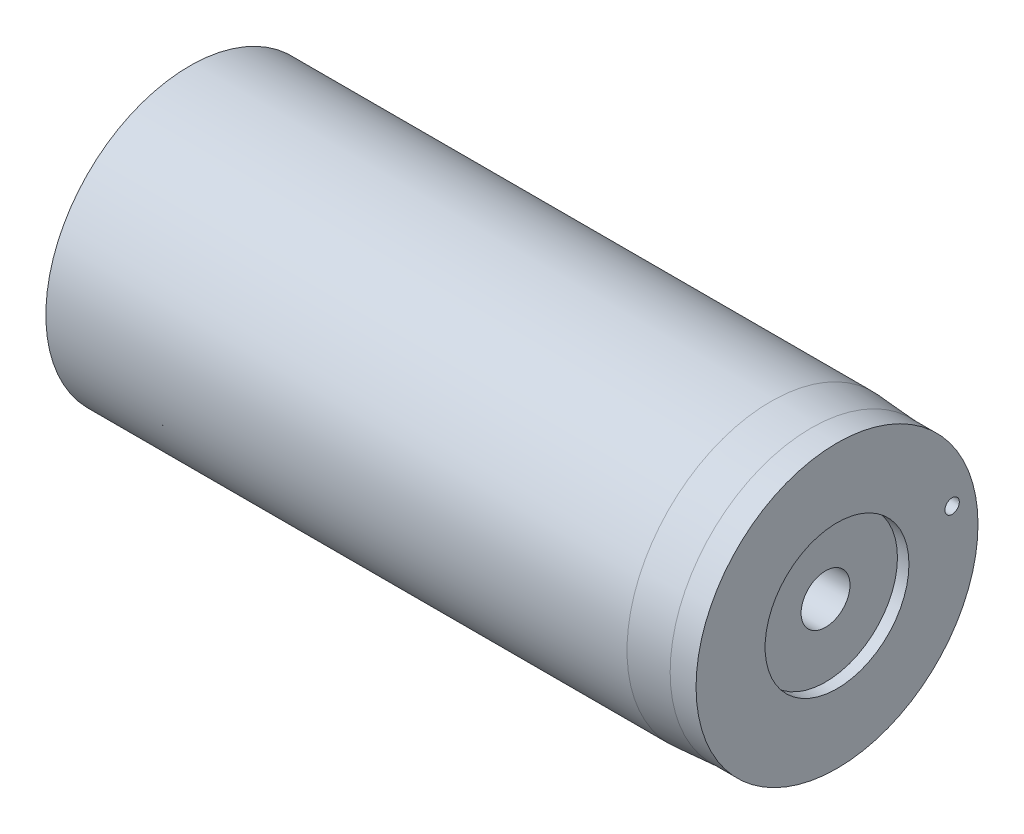
ISO-10303-21;
HEADER;
FILE_DESCRIPTION(('STEP AP214'),'2;1');
FILE_NAME('part.step','',(''),(''),'','','');
FILE_SCHEMA(('AUTOMOTIVE_DESIGN { 1 0 10303 214 1 1 1 1 }'));
ENDSEC;
DATA;
#1=APPLICATION_CONTEXT('core data for automotive mechanical design processes');
#2=APPLICATION_PROTOCOL_DEFINITION('international standard','automotive_design',2000,#1);
#3=PRODUCT_CONTEXT('',#1,'mechanical');
#4=PRODUCT('Part','Part','',(#3));
#5=PRODUCT_RELATED_PRODUCT_CATEGORY('part','',(#4));
#6=PRODUCT_DEFINITION_FORMATION('','',#4);
#7=PRODUCT_DEFINITION_CONTEXT('part definition',#1,'design');
#8=PRODUCT_DEFINITION('design','',#6,#7);
#9=PRODUCT_DEFINITION_SHAPE('','',#8);
#10=(LENGTH_UNIT() NAMED_UNIT(*) SI_UNIT(.MILLI.,.METRE.));
#11=(NAMED_UNIT(*) PLANE_ANGLE_UNIT() SI_UNIT($,.RADIAN.));
#12=(NAMED_UNIT(*) SI_UNIT($,.STERADIAN.) SOLID_ANGLE_UNIT());
#13=UNCERTAINTY_MEASURE_WITH_UNIT(LENGTH_MEASURE(1.E-05),#10,'distance_accuracy_value','');
#14=(GEOMETRIC_REPRESENTATION_CONTEXT(3) GLOBAL_UNCERTAINTY_ASSIGNED_CONTEXT((#13)) GLOBAL_UNIT_ASSIGNED_CONTEXT((#10,
#11,#12)) REPRESENTATION_CONTEXT('',''));
#15=CARTESIAN_POINT('',(0.,0.,0.));
#16=DIRECTION('',(0.,0.,1.));
#17=DIRECTION('',(1.,0.,0.));
#18=AXIS2_PLACEMENT_3D('',#15,#16,#17);
#19=CARTESIAN_POINT('',(-4.76181343216974,8.50000000000001,0.));
#20=DIRECTION('',(1.,0.,0.));
#21=DIRECTION('',(0.,0.,-1.));
#22=AXIS2_PLACEMENT_3D('',#19,#20,#21);
#23=PLANE('',#22);
#24=CARTESIAN_POINT('',(-4.76181343216974,0.,0.));
#25=DIRECTION('',(1.,0.,0.));
#26=DIRECTION('',(0.,0.,-1.));
#27=AXIS2_PLACEMENT_3D('',#24,#25,#26);
#28=CIRCLE('',#27,25.);
#29=CARTESIAN_POINT('',(-4.76181343216974,0.,-25.));
#30=VERTEX_POINT('',#29);
#31=EDGE_CURVE('E10',#30,#30,#28,.T.);
#32=ORIENTED_EDGE('',*,*,#31,.T.);
#33=EDGE_LOOP('',(#32));
#34=FACE_BOUND('',#33,.T.);
#35=CARTESIAN_POINT('',(-4.76181343216973,0.,0.));
#36=DIRECTION('',(1.,0.,0.));
#37=DIRECTION('',(0.,0.,-1.));
#38=AXIS2_PLACEMENT_3D('',#35,#36,#37);
#39=CIRCLE('',#38,8.50000000000001);
#40=CARTESIAN_POINT('',(-4.76181343216973,0.,-8.50000000000001));
#41=VERTEX_POINT('',#40);
#42=EDGE_CURVE('E97',#41,#41,#39,.T.);
#43=ORIENTED_EDGE('',*,*,#42,.F.);
#44=EDGE_LOOP('',(#43));
#45=FACE_BOUND('',#44,.T.);
#46=ADVANCED_FACE('F30',(#34,#45),#23,.T.);
#47=CARTESIAN_POINT('',(0.,0.,0.));
#48=DIRECTION('',(1.,0.,0.));
#49=DIRECTION('',(0.,0.,-1.));
#50=AXIS2_PLACEMENT_3D('',#47,#48,#49);
#51=CYLINDRICAL_SURFACE('',#50,25.);
#52=CARTESIAN_POINT('',(-0.761813432169739,0.,0.));
#53=DIRECTION('',(1.,0.,0.));
#54=DIRECTION('',(0.,0.,-1.));
#55=AXIS2_PLACEMENT_3D('',#52,#53,#54);
#56=CIRCLE('',#55,25.);
#57=CARTESIAN_POINT('',(-0.761813432169739,0.,-25.));
#58=VERTEX_POINT('',#57);
#59=EDGE_CURVE('E37',#58,#58,#56,.T.);
#60=ORIENTED_EDGE('',*,*,#59,.T.);
#61=EDGE_LOOP('',(#60));
#62=FACE_BOUND('',#61,.T.);
#63=ORIENTED_EDGE('',*,*,#31,.F.);
#64=EDGE_LOOP('',(#63));
#65=FACE_BOUND('',#64,.T.);
#66=ADVANCED_FACE('F181',(#62,#65),#51,.F.);
#67=CARTESIAN_POINT('',(-0.761813432169739,25.,0.));
#68=DIRECTION('',(1.,0.,0.));
#69=DIRECTION('',(0.,0.,-1.));
#70=AXIS2_PLACEMENT_3D('',#67,#68,#69);
#71=PLANE('',#70);
#72=CARTESIAN_POINT('',(-0.761813432169738,9.99999999999998,-39.9999999999999));
#73=DIRECTION('',(1.,0.,0.));
#74=DIRECTION('',(0.,0.,-1.));
#75=AXIS2_PLACEMENT_3D('',#72,#73,#74);
#76=CIRCLE('',#75,2.49999999999999);
#77=CARTESIAN_POINT('',(-0.761813432169738,9.99999999999998,-42.4999999999999));
#78=VERTEX_POINT('',#77);
#79=EDGE_CURVE('E100',#78,#78,#76,.T.);
#80=ORIENTED_EDGE('',*,*,#79,.F.);
#81=EDGE_LOOP('',(#80));
#82=FACE_BOUND('',#81,.T.);
#83=CARTESIAN_POINT('',(-0.761813432169739,0.,0.));
#84=DIRECTION('',(1.,0.,0.));
#85=DIRECTION('',(0.,0.,-1.));
#86=AXIS2_PLACEMENT_3D('',#83,#84,#85);
#87=CIRCLE('',#86,49.);
#88=CARTESIAN_POINT('',(-0.761813432169739,0.,-49.));
#89=VERTEX_POINT('',#88);
#90=EDGE_CURVE('E41',#89,#89,#87,.T.);
#91=ORIENTED_EDGE('',*,*,#90,.T.);
#92=EDGE_LOOP('',(#91));
#93=FACE_BOUND('',#92,.T.);
#94=ORIENTED_EDGE('',*,*,#59,.F.);
#95=EDGE_LOOP('',(#94));
#96=FACE_BOUND('',#95,.T.);
#97=ADVANCED_FACE('F175',(#82,#93,#96),#71,.T.);
#98=CARTESIAN_POINT('',(0.,0.,0.));
#99=DIRECTION('',(1.,0.,0.));
#100=DIRECTION('',(0.,0.,-1.));
#101=AXIS2_PLACEMENT_3D('',#98,#99,#100);
#102=CYLINDRICAL_SURFACE('',#101,49.);
#103=CARTESIAN_POINT('',(-9.76181343216974,0.,0.));
#104=DIRECTION('',(1.,0.,0.));
#105=DIRECTION('',(0.,0.,-1.));
#106=AXIS2_PLACEMENT_3D('',#103,#104,#105);
#107=CIRCLE('',#106,49.);
#108=CARTESIAN_POINT('',(-9.76181343216974,0.,-49.));
#109=VERTEX_POINT('',#108);
#110=EDGE_CURVE('E46',#109,#109,#107,.T.);
#111=ORIENTED_EDGE('',*,*,#110,.T.);
#112=EDGE_LOOP('',(#111));
#113=FACE_BOUND('',#112,.T.);
#114=ORIENTED_EDGE('',*,*,#90,.F.);
#115=EDGE_LOOP('',(#114));
#116=FACE_BOUND('',#115,.T.);
#117=ADVANCED_FACE('F169',(#113,#116),#102,.T.);
#118=CARTESIAN_POINT('',(-9.76181343216974,0.,0.));
#119=DIRECTION('',(-1.,0.,0.));
#120=DIRECTION('',(0.,0.,1.));
#121=AXIS2_PLACEMENT_3D('',#118,#119,#120);
#122=CONICAL_SURFACE('',#121,49.,0.0713074647852899);
#123=CARTESIAN_POINT('',(-23.7618134321697,0.,0.));
#124=DIRECTION('',(1.,0.,0.));
#125=DIRECTION('',(0.,0.,-1.));
#126=AXIS2_PLACEMENT_3D('',#123,#124,#125);
#127=CIRCLE('',#126,50.);
#128=CARTESIAN_POINT('',(-23.7618134321697,0.,-50.));
#129=VERTEX_POINT('',#128);
#130=EDGE_CURVE('E49',#129,#129,#127,.T.);
#131=ORIENTED_EDGE('',*,*,#130,.T.);
#132=EDGE_LOOP('',(#131));
#133=FACE_BOUND('',#132,.T.);
#134=ORIENTED_EDGE('',*,*,#110,.F.);
#135=EDGE_LOOP('',(#134));
#136=FACE_BOUND('',#135,.T.);
#137=ADVANCED_FACE('F163',(#133,#136),#122,.T.);
#138=CARTESIAN_POINT('',(0.,0.,0.));
#139=DIRECTION('',(1.,0.,0.));
#140=DIRECTION('',(0.,0.,-1.));
#141=AXIS2_PLACEMENT_3D('',#138,#139,#140);
#142=CYLINDRICAL_SURFACE('',#141,50.);
#143=CARTESIAN_POINT('',(-225.76181343217,0.,0.));
#144=DIRECTION('',(1.,0.,0.));
#145=DIRECTION('',(0.,0.,-1.));
#146=AXIS2_PLACEMENT_3D('',#143,#144,#145);
#147=CIRCLE('',#146,50.);
#148=CARTESIAN_POINT('',(-225.76181343217,0.,-50.));
#149=VERTEX_POINT('',#148);
#150=EDGE_CURVE('E52',#149,#149,#147,.T.);
#151=ORIENTED_EDGE('',*,*,#150,.T.);
#152=EDGE_LOOP('',(#151));
#153=FACE_BOUND('',#152,.T.);
#154=ORIENTED_EDGE('',*,*,#130,.F.);
#155=EDGE_LOOP('',(#154));
#156=FACE_BOUND('',#155,.T.);
#157=ADVANCED_FACE('F157',(#153,#156),#142,.T.);
#158=CARTESIAN_POINT('',(-225.76181343217,50.,0.));
#159=DIRECTION('',(-1.,0.,0.));
#160=DIRECTION('',(0.,0.,1.));
#161=AXIS2_PLACEMENT_3D('',#158,#159,#160);
#162=PLANE('',#161);
#163=CARTESIAN_POINT('',(-225.76181343217,0.,0.));
#164=DIRECTION('',(1.,0.,0.));
#165=DIRECTION('',(0.,0.,-1.));
#166=AXIS2_PLACEMENT_3D('',#163,#164,#165);
#167=CIRCLE('',#166,48.5);
#168=CARTESIAN_POINT('',(-225.76181343217,0.,-48.5));
#169=VERTEX_POINT('',#168);
#170=EDGE_CURVE('E55',#169,#169,#167,.T.);
#171=ORIENTED_EDGE('',*,*,#170,.T.);
#172=EDGE_LOOP('',(#171));
#173=FACE_BOUND('',#172,.T.);
#174=ORIENTED_EDGE('',*,*,#150,.F.);
#175=EDGE_LOOP('',(#174));
#176=FACE_BOUND('',#175,.T.);
#177=ADVANCED_FACE('F151',(#173,#176),#162,.T.);
#178=CARTESIAN_POINT('',(0.,0.,0.));
#179=DIRECTION('',(1.,0.,0.));
#180=DIRECTION('',(0.,0.,-1.));
#181=AXIS2_PLACEMENT_3D('',#178,#179,#180);
#182=CYLINDRICAL_SURFACE('',#181,48.5);
#183=CARTESIAN_POINT('',(-221.76181343217,0.,0.));
#184=DIRECTION('',(1.,0.,0.));
#185=DIRECTION('',(0.,0.,-1.));
#186=AXIS2_PLACEMENT_3D('',#183,#184,#185);
#187=CIRCLE('',#186,48.5);
#188=CARTESIAN_POINT('',(-221.76181343217,0.,-48.5));
#189=VERTEX_POINT('',#188);
#190=EDGE_CURVE('E58',#189,#189,#187,.T.);
#191=ORIENTED_EDGE('',*,*,#190,.T.);
#192=EDGE_LOOP('',(#191));
#193=FACE_BOUND('',#192,.T.);
#194=ORIENTED_EDGE('',*,*,#170,.F.);
#195=EDGE_LOOP('',(#194));
#196=FACE_BOUND('',#195,.T.);
#197=ADVANCED_FACE('F145',(#193,#196),#182,.F.);
#198=CARTESIAN_POINT('',(-221.76181343217,48.5,0.));
#199=DIRECTION('',(-1.,0.,0.));
#200=DIRECTION('',(0.,0.,1.));
#201=AXIS2_PLACEMENT_3D('',#198,#199,#200);
#202=PLANE('',#201);
#203=CARTESIAN_POINT('',(-221.76181343217,0.,0.));
#204=DIRECTION('',(1.,0.,0.));
#205=DIRECTION('',(0.,0.,-1.));
#206=AXIS2_PLACEMENT_3D('',#203,#204,#205);
#207=CIRCLE('',#206,47.9999999999991);
#208=CARTESIAN_POINT('',(-221.76181343217,0.,-47.9999999999991));
#209=VERTEX_POINT('',#208);
#210=EDGE_CURVE('E61',#209,#209,#207,.T.);
#211=ORIENTED_EDGE('',*,*,#210,.T.);
#212=EDGE_LOOP('',(#211));
#213=FACE_BOUND('',#212,.T.);
#214=ORIENTED_EDGE('',*,*,#190,.F.);
#215=EDGE_LOOP('',(#214));
#216=FACE_BOUND('',#215,.T.);
#217=ADVANCED_FACE('F139',(#213,#216),#202,.T.);
#218=CARTESIAN_POINT('',(0.,0.,0.));
#219=DIRECTION('',(1.,0.,0.));
#220=DIRECTION('',(0.,0.,-1.));
#221=AXIS2_PLACEMENT_3D('',#218,#219,#220);
#222=CYLINDRICAL_SURFACE('',#221,47.9999999999991);
#223=CARTESIAN_POINT('',(-214.26181343217,0.,0.));
#224=DIRECTION('',(1.,0.,0.));
#225=DIRECTION('',(0.,0.,-1.));
#226=AXIS2_PLACEMENT_3D('',#223,#224,#225);
#227=CIRCLE('',#226,47.9999999999991);
#228=CARTESIAN_POINT('',(-214.26181343217,0.,-47.9999999999991));
#229=VERTEX_POINT('',#228);
#230=EDGE_CURVE('E64',#229,#229,#227,.T.);
#231=ORIENTED_EDGE('',*,*,#230,.T.);
#232=EDGE_LOOP('',(#231));
#233=FACE_BOUND('',#232,.T.);
#234=ORIENTED_EDGE('',*,*,#210,.F.);
#235=EDGE_LOOP('',(#234));
#236=FACE_BOUND('',#235,.T.);
#237=ADVANCED_FACE('F133',(#233,#236),#222,.F.);
#238=CARTESIAN_POINT('',(-214.26181343217,45.5030486286494,0.));
#239=DIRECTION('',(-1.,0.,0.));
#240=DIRECTION('',(0.,0.,1.));
#241=AXIS2_PLACEMENT_3D('',#238,#239,#240);
#242=PLANE('',#241);
#243=CARTESIAN_POINT('',(-214.26181343217,0.,0.));
#244=DIRECTION('',(1.,0.,0.));
#245=DIRECTION('',(0.,0.,-1.));
#246=AXIS2_PLACEMENT_3D('',#243,#244,#245);
#247=CIRCLE('',#246,45.5030486286494);
#248=CARTESIAN_POINT('',(-214.26181343217,45.5030486286494,0.));
#249=VERTEX_POINT('',#248);
#250=EDGE_CURVE('E67',#249,#249,#247,.T.);
#251=ORIENTED_EDGE('',*,*,#250,.T.);
#252=EDGE_LOOP('',(#251));
#253=FACE_BOUND('',#252,.T.);
#254=ORIENTED_EDGE('',*,*,#230,.F.);
#255=EDGE_LOOP('',(#254));
#256=FACE_BOUND('',#255,.T.);
#257=ADVANCED_FACE('F127',(#253,#256),#242,.T.);
#258=CARTESIAN_POINT('',(-325.299971582865,0.,0.));
#259=DIRECTION('',(1.,0.,0.));
#260=DIRECTION('',(0.,1.,0.));
#261=AXIS2_PLACEMENT_3D('',#258,#259,#260);
#262=SPHERICAL_SURFACE('',#261,120.);
#263=CARTESIAN_POINT('',(-213.856039491432,0.,0.));
#264=DIRECTION('',(1.,0.,0.));
#265=DIRECTION('',(0.,0.,-1.));
#266=AXIS2_PLACEMENT_3D('',#263,#264,#265);
#267=CIRCLE('',#266,44.5);
#268=CARTESIAN_POINT('',(-213.856039491432,44.5,0.));
#269=VERTEX_POINT('',#268);
#270=EDGE_CURVE('E70',#269,#269,#267,.T.);
#271=CARTESIAN_POINT('',(-213.856039491432,44.5,0.));
#272=CARTESIAN_POINT('',(-213.860219168837,44.5104674086508,0.));
#273=CARTESIAN_POINT('',(-213.864400320975,44.5209342284351,0.));
#274=CARTESIAN_POINT('',(-213.872765574384,44.5418666894399,0.));
#275=CARTESIAN_POINT('',(-213.876949675654,44.5523323306604,0.));
#276=CARTESIAN_POINT('',(-213.885320826996,44.5732624337066,0.));
#277=CARTESIAN_POINT('',(-213.889507877067,44.5837268955323,0.));
#278=CARTESIAN_POINT('',(-213.897884925677,44.604654638958,0.));
#279=CARTESIAN_POINT('',(-213.902074924216,44.6151179205581,0.));
#280=CARTESIAN_POINT('',(-213.910457869429,44.6360433027017,0.));
#281=CARTESIAN_POINT('',(-213.914650816104,44.6465054032454,0.));
#282=CARTESIAN_POINT('',(-213.923039657255,44.6674284224455,0.));
#283=CARTESIAN_POINT('',(-213.927235551731,44.6778893411021,0.));
#284=CARTESIAN_POINT('',(-213.935630288154,44.6988099956975,0.));
#285=CARTESIAN_POINT('',(-213.9398291301,44.7092697316364,0.));
#286=CARTESIAN_POINT('',(-213.948229761128,44.7301880199661,0.));
#287=CARTESIAN_POINT('',(-213.95243155021,44.7406465723568,0.));
#288=CARTESIAN_POINT('',(-213.960838075176,44.7615624927598,0.));
#289=CARTESIAN_POINT('',(-213.96504281106,44.7720198607721,0.));
#290=CARTESIAN_POINT('',(-213.973455229296,44.7929334115877,0.));
#291=CARTESIAN_POINT('',(-213.977662911649,44.8033895943912,0.));
#292=CARTESIAN_POINT('',(-213.986081222488,44.824300773959,0.));
#293=CARTESIAN_POINT('',(-213.990291850975,44.8347557707235,0.));
#294=CARTESIAN_POINT('',(-213.998716053749,44.8556645773832,0.));
#295=CARTESIAN_POINT('',(-214.002929628036,44.8661183872785,0.));
#296=CARTESIAN_POINT('',(-214.011359722075,44.88702481937,0.));
#297=CARTESIAN_POINT('',(-214.015576241827,44.8974774415662,0.));
#298=CARTESIAN_POINT('',(-214.024012226463,44.9183814974296,0.));
#299=CARTESIAN_POINT('',(-214.028231691346,44.9288329310968,0.));
#300=CARTESIAN_POINT('',(-214.036673565908,44.9497346090723,0.));
#301=CARTESIAN_POINT('',(-214.040895975586,44.9601848533806,0.));
#302=CARTESIAN_POINT('',(-214.049343739404,44.9810841518086,0.));
#303=CARTESIAN_POINT('',(-214.053569093543,44.9915332059284,0.));
#304=CARTESIAN_POINT('',(-214.062022745947,45.0124301231497,0.));
#305=CARTESIAN_POINT('',(-214.066251044211,45.0228779862512,0.));
#306=CARTESIAN_POINT('',(-214.074710584528,45.0437725206065,0.));
#307=CARTESIAN_POINT('',(-214.078941826581,45.0542191918603,0.));
#308=CARTESIAN_POINT('',(-214.087407254141,45.0751113416907,0.));
#309=CARTESIAN_POINT('',(-214.091641439648,45.0855568202673,0.));
#310=CARTESIAN_POINT('',(-214.100112753778,45.1064465839139,0.));
#311=CARTESIAN_POINT('',(-214.104349882402,45.116890868984,0.));
#312=CARTESIAN_POINT('',(-214.11282708243,45.1377782447884,0.));
#313=CARTESIAN_POINT('',(-214.117067153834,45.1482213355226,0.));
#314=CARTESIAN_POINT('',(-214.125550239087,45.1691063218263,0.));
#315=CARTESIAN_POINT('',(-214.129793252935,45.1795482173956,0.));
#316=CARTESIAN_POINT('',(-214.138282222739,45.2004308125403,0.));
#317=CARTESIAN_POINT('',(-214.142528178695,45.2108715121156,0.));
#318=CARTESIAN_POINT('',(-214.151023032376,45.2317517144433,0.));
#319=CARTESIAN_POINT('',(-214.155271930101,45.2421912171956,0.));
#320=CARTESIAN_POINT('',(-214.163772666985,45.2630690250485,0.));
#321=CARTESIAN_POINT('',(-214.168024506143,45.273507330149,0.));
#322=CARTESIAN_POINT('',(-214.176531125555,45.2943827418694,0.));
#323=CARTESIAN_POINT('',(-214.180785905808,45.3048198484893,0.));
#324=CARTESIAN_POINT('',(-214.189298407072,45.3256928624198,0.));
#325=CARTESIAN_POINT('',(-214.193556128082,45.3361287697303,0.));
#326=CARTESIAN_POINT('',(-214.202074510523,45.3569993842136,0.));
#327=CARTESIAN_POINT('',(-214.206335171952,45.3674340913863,0.));
#328=CARTESIAN_POINT('',(-214.214859434893,45.3883023047653,0.));
#329=CARTESIAN_POINT('',(-214.219123036403,45.3987358109716,0.));
#330=CARTESIAN_POINT('',(-214.227653179167,45.4196016215894,0.));
#331=CARTESIAN_POINT('',(-214.23191972042,45.4300339260009,0.));
#332=CARTESIAN_POINT('',(-214.24045574233,45.4508973322008,0.));
#333=CARTESIAN_POINT('',(-214.244725222987,45.4613284339893,0.));
#334=CARTESIAN_POINT('',(-214.253267123365,45.4821894341149,0.));
#335=CARTESIAN_POINT('',(-214.257539543086,45.492619332452,0.));
#336=CARTESIAN_POINT('',(-214.26181343217,45.5030486286494,0.));
#337=B_SPLINE_CURVE_WITH_KNOTS('',3,(#271,#272,#273,#274,#275,#276,#277,#278,#279,#280,#281,
#282,#283,#284,#285,#286,#287,#288,#289,#290,#291,#292,#293,#294,#295,#296,#297,#298,#299,#300,
#301,#302,#303,#304,#305,#306,#307,#308,#309,#310,#311,#312,#313,#314,#315,#316,#317,#318,#319,
#320,#321,#322,#323,#324,#325,#326,#327,#328,#329,#330,#331,#332,#333,#334,#335,#336),
.UNSPECIFIED.,.F.,.F.,(4,2,2,2,2,2,2,2,2,2,2,2,2,2,2,2,2,2,2,2,2,2,2,2,2,2,2,2,2,2,2,2,4),(0.,
0.0338131204730844,0.0676262409461675,0.101439361419259,0.135252481892335,0.169065602365417,
0.202878722838512,0.2366918433116,0.270504963784684,0.304318084257769,0.338131204730835,
0.371944325203933,0.405757445677011,0.439570566150108,0.473383686623183,0.507196807096275,
0.541009927569352,0.574823048042454,0.608636168515531,0.642449288988608,0.676262409461695,
0.710075529934785,0.743888650407867,0.777701770880955,0.811514891354049,0.845328011827125,
0.879141132300196,0.912954252773287,0.946767373246382,0.98058049371946,1.01439361419255,
1.04820673466563,1.08201985513871),.UNSPECIFIED.);
#338=EDGE_CURVE('BSEAM121',#269,#249,#337,.T.);
#339=ORIENTED_EDGE('',*,*,#270,.T.);
#340=ORIENTED_EDGE('',*,*,#250,.F.);
#341=ORIENTED_EDGE('',*,*,#338,.T.);
#342=ORIENTED_EDGE('',*,*,#338,.F.);
#343=EDGE_LOOP('',(#339,#341,#340,#342));
#344=FACE_BOUND('',#343,.T.);
#345=ADVANCED_FACE('F121',(#344),#262,.F.);
#346=CARTESIAN_POINT('',(0.,0.,0.));
#347=DIRECTION('',(1.,0.,0.));
#348=DIRECTION('',(0.,0.,-1.));
#349=AXIS2_PLACEMENT_3D('',#346,#347,#348);
#350=CYLINDRICAL_SURFACE('',#349,44.5);
#351=CARTESIAN_POINT('',(-9.76181343216975,0.,0.));
#352=DIRECTION('',(1.,0.,0.));
#353=DIRECTION('',(0.,0.,-1.));
#354=AXIS2_PLACEMENT_3D('',#351,#352,#353);
#355=CIRCLE('',#354,44.5);
#356=CARTESIAN_POINT('',(-9.76181343216975,0.,-44.5));
#357=VERTEX_POINT('',#356);
#358=EDGE_CURVE('E73',#357,#357,#355,.T.);
#359=ORIENTED_EDGE('',*,*,#358,.T.);
#360=EDGE_LOOP('',(#359));
#361=FACE_BOUND('',#360,.T.);
#362=ORIENTED_EDGE('',*,*,#270,.F.);
#363=EDGE_LOOP('',(#362));
#364=FACE_BOUND('',#363,.T.);
#365=ADVANCED_FACE('F113',(#361,#364),#350,.F.);
#366=CARTESIAN_POINT('',(-9.76181343216975,44.5,0.));
#367=DIRECTION('',(-1.,0.,0.));
#368=DIRECTION('',(0.,0.,1.));
#369=AXIS2_PLACEMENT_3D('',#366,#367,#368);
#370=PLANE('',#369);
#371=CARTESIAN_POINT('',(-9.76181343216975,9.99999999999998,-39.9999999999999));
#372=DIRECTION('',(-1.,0.,0.));
#373=DIRECTION('',(0.,0.,1.));
#374=AXIS2_PLACEMENT_3D('',#371,#372,#373);
#375=CIRCLE('',#374,2.49999999999997);
#376=CARTESIAN_POINT('',(-9.76181343216975,9.99999999999998,-37.5));
#377=VERTEX_POINT('',#376);
#378=EDGE_CURVE('E33',#377,#377,#375,.T.);
#379=ORIENTED_EDGE('',*,*,#378,.F.);
#380=EDGE_LOOP('',(#379));
#381=FACE_BOUND('',#380,.T.);
#382=CARTESIAN_POINT('',(-9.76181343216974,0.,0.));
#383=DIRECTION('',(1.,0.,0.));
#384=DIRECTION('',(0.,0.,-1.));
#385=AXIS2_PLACEMENT_3D('',#382,#383,#384);
#386=CIRCLE('',#385,15.);
#387=CARTESIAN_POINT('',(-9.76181343216974,0.,-15.));
#388=VERTEX_POINT('',#387);
#389=EDGE_CURVE('E76',#388,#388,#386,.T.);
#390=ORIENTED_EDGE('',*,*,#389,.T.);
#391=EDGE_LOOP('',(#390));
#392=FACE_BOUND('',#391,.T.);
#393=ORIENTED_EDGE('',*,*,#358,.F.);
#394=EDGE_LOOP('',(#393));
#395=FACE_BOUND('',#394,.T.);
#396=ADVANCED_FACE('F109',(#381,#392,#395),#370,.T.);
#397=CARTESIAN_POINT('',(0.,0.,0.));
#398=DIRECTION('',(1.,0.,0.));
#399=DIRECTION('',(0.,0.,-1.));
#400=AXIS2_PLACEMENT_3D('',#397,#398,#399);
#401=CYLINDRICAL_SURFACE('',#400,15.);
#402=CARTESIAN_POINT('',(-24.7618134321697,0.,0.));
#403=DIRECTION('',(1.,0.,0.));
#404=DIRECTION('',(0.,0.,-1.));
#405=AXIS2_PLACEMENT_3D('',#402,#403,#404);
#406=CIRCLE('',#405,15.);
#407=CARTESIAN_POINT('',(-24.7618134321697,0.,-15.));
#408=VERTEX_POINT('',#407);
#409=EDGE_CURVE('E79',#408,#408,#406,.T.);
#410=ORIENTED_EDGE('',*,*,#409,.T.);
#411=EDGE_LOOP('',(#410));
#412=FACE_BOUND('',#411,.T.);
#413=ORIENTED_EDGE('',*,*,#389,.F.);
#414=EDGE_LOOP('',(#413));
#415=FACE_BOUND('',#414,.T.);
#416=ADVANCED_FACE('F112',(#412,#415),#401,.T.);
#417=CARTESIAN_POINT('',(-24.7618134321697,15.,0.));
#418=DIRECTION('',(-1.,0.,0.));
#419=DIRECTION('',(0.,0.,1.));
#420=AXIS2_PLACEMENT_3D('',#417,#418,#419);
#421=PLANE('',#420);
#422=CARTESIAN_POINT('',(-24.7618134321697,0.,0.));
#423=DIRECTION('',(1.,0.,0.));
#424=DIRECTION('',(0.,0.,-1.));
#425=AXIS2_PLACEMENT_3D('',#422,#423,#424);
#426=CIRCLE('',#425,12.5);
#427=CARTESIAN_POINT('',(-24.7618134321697,0.,-12.5));
#428=VERTEX_POINT('',#427);
#429=EDGE_CURVE('E82',#428,#428,#426,.T.);
#430=ORIENTED_EDGE('',*,*,#429,.T.);
#431=EDGE_LOOP('',(#430));
#432=FACE_BOUND('',#431,.T.);
#433=ORIENTED_EDGE('',*,*,#409,.F.);
#434=EDGE_LOOP('',(#433));
#435=FACE_BOUND('',#434,.T.);
#436=ADVANCED_FACE('F194',(#432,#435),#421,.T.);
#437=CARTESIAN_POINT('',(0.,0.,0.));
#438=DIRECTION('',(1.,0.,0.));
#439=DIRECTION('',(0.,0.,-1.));
#440=AXIS2_PLACEMENT_3D('',#437,#438,#439);
#441=CYLINDRICAL_SURFACE('',#440,12.5);
#442=CARTESIAN_POINT('',(-64.7618134321697,0.,0.));
#443=DIRECTION('',(1.,0.,0.));
#444=DIRECTION('',(0.,0.,-1.));
#445=AXIS2_PLACEMENT_3D('',#442,#443,#444);
#446=CIRCLE('',#445,12.5);
#447=CARTESIAN_POINT('',(-64.7618134321697,0.,-12.5));
#448=VERTEX_POINT('',#447);
#449=EDGE_CURVE('E85',#448,#448,#446,.T.);
#450=ORIENTED_EDGE('',*,*,#449,.T.);
#451=EDGE_LOOP('',(#450));
#452=FACE_BOUND('',#451,.T.);
#453=ORIENTED_EDGE('',*,*,#429,.F.);
#454=EDGE_LOOP('',(#453));
#455=FACE_BOUND('',#454,.T.);
#456=ADVANCED_FACE('F198',(#452,#455),#441,.T.);
#457=CARTESIAN_POINT('',(-64.7618134321697,12.5,0.));
#458=DIRECTION('',(-1.,0.,0.));
#459=DIRECTION('',(0.,0.,1.));
#460=AXIS2_PLACEMENT_3D('',#457,#458,#459);
#461=PLANE('',#460);
#462=CARTESIAN_POINT('',(-64.7618134321697,0.,0.));
#463=DIRECTION('',(1.,0.,0.));
#464=DIRECTION('',(0.,0.,-1.));
#465=AXIS2_PLACEMENT_3D('',#462,#463,#464);
#466=CIRCLE('',#465,9.99999999999999);
#467=CARTESIAN_POINT('',(-64.7618134321697,0.,-9.99999999999999));
#468=VERTEX_POINT('',#467);
#469=EDGE_CURVE('E88',#468,#468,#466,.T.);
#470=ORIENTED_EDGE('',*,*,#469,.T.);
#471=EDGE_LOOP('',(#470));
#472=FACE_BOUND('',#471,.T.);
#473=ORIENTED_EDGE('',*,*,#449,.F.);
#474=EDGE_LOOP('',(#473));
#475=FACE_BOUND('',#474,.T.);
#476=ADVANCED_FACE('F202',(#472,#475),#461,.T.);
#477=CARTESIAN_POINT('',(0.,0.,0.));
#478=DIRECTION('',(1.,0.,0.));
#479=DIRECTION('',(0.,0.,-1.));
#480=AXIS2_PLACEMENT_3D('',#477,#478,#479);
#481=CYLINDRICAL_SURFACE('',#480,9.99999999999999);
#482=CARTESIAN_POINT('',(-124.76181343217,0.,0.));
#483=DIRECTION('',(1.,0.,0.));
#484=DIRECTION('',(0.,0.,-1.));
#485=AXIS2_PLACEMENT_3D('',#482,#483,#484);
#486=CIRCLE('',#485,9.99999999999999);
#487=CARTESIAN_POINT('',(-124.76181343217,0.,-9.99999999999999));
#488=VERTEX_POINT('',#487);
#489=EDGE_CURVE('E91',#488,#488,#486,.T.);
#490=ORIENTED_EDGE('',*,*,#489,.T.);
#491=EDGE_LOOP('',(#490));
#492=FACE_BOUND('',#491,.T.);
#493=ORIENTED_EDGE('',*,*,#469,.F.);
#494=EDGE_LOOP('',(#493));
#495=FACE_BOUND('',#494,.T.);
#496=ADVANCED_FACE('F206',(#492,#495),#481,.T.);
#497=CARTESIAN_POINT('',(-124.76181343217,9.99999999999999,0.));
#498=DIRECTION('',(-1.,0.,0.));
#499=DIRECTION('',(0.,0.,1.));
#500=AXIS2_PLACEMENT_3D('',#497,#498,#499);
#501=PLANE('',#500);
#502=CARTESIAN_POINT('',(-124.76181343217,0.,0.));
#503=DIRECTION('',(1.,0.,0.));
#504=DIRECTION('',(0.,0.,-1.));
#505=AXIS2_PLACEMENT_3D('',#502,#503,#504);
#506=CIRCLE('',#505,8.49999999999999);
#507=CARTESIAN_POINT('',(-124.76181343217,0.,-8.49999999999999));
#508=VERTEX_POINT('',#507);
#509=EDGE_CURVE('E94',#508,#508,#506,.T.);
#510=ORIENTED_EDGE('',*,*,#509,.T.);
#511=EDGE_LOOP('',(#510));
#512=FACE_BOUND('',#511,.T.);
#513=ORIENTED_EDGE('',*,*,#489,.F.);
#514=EDGE_LOOP('',(#513));
#515=FACE_BOUND('',#514,.T.);
#516=ADVANCED_FACE('F210',(#512,#515),#501,.T.);
#517=CARTESIAN_POINT('',(0.,0.,0.));
#518=DIRECTION('',(1.,0.,0.));
#519=DIRECTION('',(0.,0.,-1.));
#520=AXIS2_PLACEMENT_3D('',#517,#518,#519);
#521=CYLINDRICAL_SURFACE('',#520,8.5);
#522=ORIENTED_EDGE('',*,*,#42,.T.);
#523=EDGE_LOOP('',(#522));
#524=FACE_BOUND('',#523,.T.);
#525=ORIENTED_EDGE('',*,*,#509,.F.);
#526=EDGE_LOOP('',(#525));
#527=FACE_BOUND('',#526,.T.);
#528=ADVANCED_FACE('F214',(#524,#527),#521,.F.);
#529=CARTESIAN_POINT('',(-0.761813432169739,9.99999999999998,-39.9999999999999));
#530=DIRECTION('',(1.,0.,0.));
#531=DIRECTION('',(0.,0.,-1.));
#532=AXIS2_PLACEMENT_3D('',#529,#530,#531);
#533=CYLINDRICAL_SURFACE('',#532,2.49999999999997);
#534=ORIENTED_EDGE('',*,*,#378,.T.);
#535=EDGE_LOOP('',(#534));
#536=FACE_BOUND('',#535,.T.);
#537=ORIENTED_EDGE('',*,*,#79,.T.);
#538=EDGE_LOOP('',(#537));
#539=FACE_BOUND('',#538,.T.);
#540=ADVANCED_FACE('F107',(#536,#539),#533,.F.);
#541=CLOSED_SHELL('',(#46,#66,#97,#117,#137,#157,#177,#197,#217,#237,#257,#345,#365,#396,#416,
#436,#456,#476,#496,#516,#528,#540));
#542=MANIFOLD_SOLID_BREP('B2',#541);
#543=ADVANCED_BREP_SHAPE_REPRESENTATION('',(#18,#542),#14);
#544=SHAPE_DEFINITION_REPRESENTATION(#9,#543);
ENDSEC;
END-ISO-10303-21;
